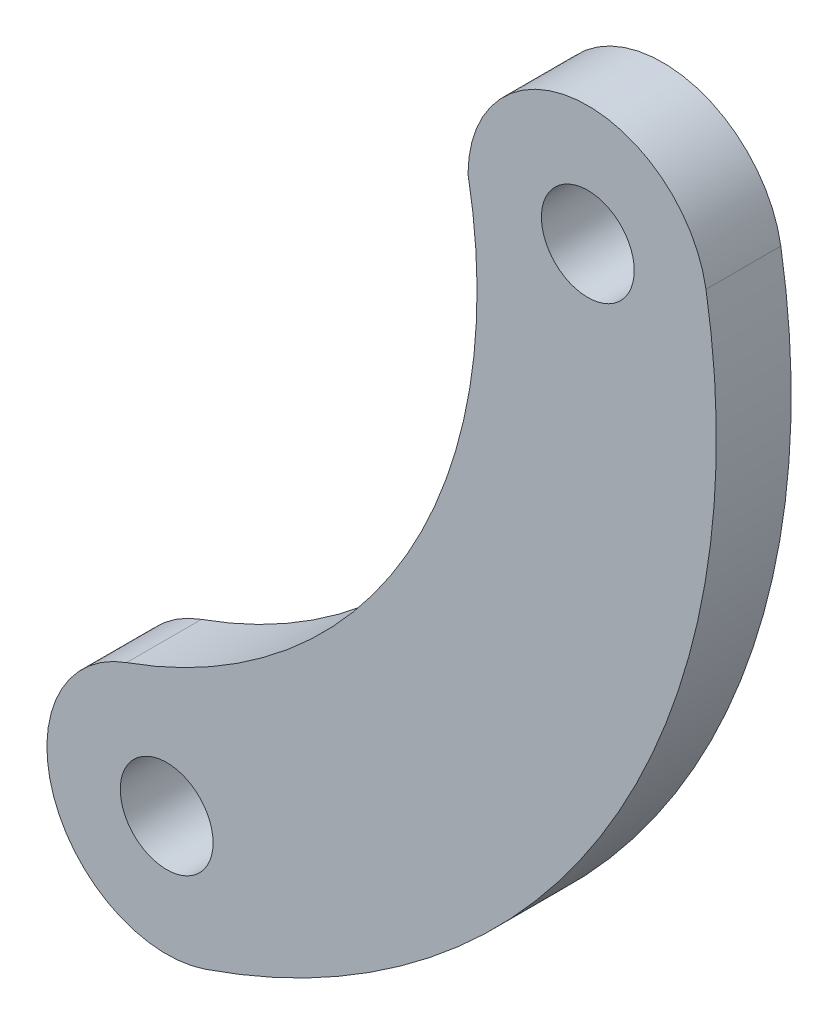
ISO-10303-21;
HEADER;
FILE_DESCRIPTION(('STEP AP214'),'2;1');
FILE_NAME('part.step','',(''),(''),'','','');
FILE_SCHEMA(('AUTOMOTIVE_DESIGN { 1 0 10303 214 1 1 1 1 }'));
ENDSEC;
DATA;
#1=APPLICATION_CONTEXT('core data for automotive mechanical design processes');
#2=APPLICATION_PROTOCOL_DEFINITION('international standard','automotive_design',2000,#1);
#3=PRODUCT_CONTEXT('',#1,'mechanical');
#4=PRODUCT('Part','Part','',(#3));
#5=PRODUCT_RELATED_PRODUCT_CATEGORY('part','',(#4));
#6=PRODUCT_DEFINITION_FORMATION('','',#4);
#7=PRODUCT_DEFINITION_CONTEXT('part definition',#1,'design');
#8=PRODUCT_DEFINITION('design','',#6,#7);
#9=PRODUCT_DEFINITION_SHAPE('','',#8);
#10=(LENGTH_UNIT() NAMED_UNIT(*) SI_UNIT(.MILLI.,.METRE.));
#11=(NAMED_UNIT(*) PLANE_ANGLE_UNIT() SI_UNIT($,.RADIAN.));
#12=(NAMED_UNIT(*) SI_UNIT($,.STERADIAN.) SOLID_ANGLE_UNIT());
#13=UNCERTAINTY_MEASURE_WITH_UNIT(LENGTH_MEASURE(1.E-05),#10,'distance_accuracy_value','');
#14=(GEOMETRIC_REPRESENTATION_CONTEXT(3) GLOBAL_UNCERTAINTY_ASSIGNED_CONTEXT((#13)) GLOBAL_UNIT_ASSIGNED_CONTEXT((#10,
#11,#12)) REPRESENTATION_CONTEXT('',''));
#15=CARTESIAN_POINT('',(0.,0.,0.));
#16=DIRECTION('',(0.,0.,1.));
#17=DIRECTION('',(1.,0.,0.));
#18=AXIS2_PLACEMENT_3D('',#15,#16,#17);
#19=CARTESIAN_POINT('',(-2.67304825428944,-6.90797107722297,2.5));
#20=DIRECTION('',(0.,0.,-1.));
#21=DIRECTION('',(-1.,0.,0.));
#22=AXIS2_PLACEMENT_3D('',#19,#20,#21);
#23=PLANE('',#22);
#24=CARTESIAN_POINT('',(7.79019795096132,-5.15608642723372,2.5));
#25=DIRECTION('',(0.,0.,1.));
#26=DIRECTION('',(-1.,0.,0.));
#27=AXIS2_PLACEMENT_3D('',#24,#25,#26);
#28=CIRCLE('',#27,4.00206583250989);
#29=CARTESIAN_POINT('',(11.7373202586664,-4.49521093535922,2.5));
#30=VERTEX_POINT('',#29);
#31=CARTESIAN_POINT('',(3.78820929800643,-5.13123186299868,2.5));
#32=VERTEX_POINT('',#31);
#33=EDGE_CURVE('E87',#30,#32,#28,.T.);
#34=ORIENTED_EDGE('',*,*,#33,.T.);
#35=CARTESIAN_POINT('',(-13.5144426672139,-8.38303497187139,2.5));
#36=DIRECTION('',(0.,0.,-1.));
#37=DIRECTION('',(-1.,0.,0.));
#38=AXIS2_PLACEMENT_3D('',#35,#36,#37);
#39=CIRCLE('',#38,17.6055669743527);
#40=CARTESIAN_POINT('',(-7.61656877226157,-24.9713161368281,2.5));
#41=VERTEX_POINT('',#40);
#42=EDGE_CURVE('E82',#32,#41,#39,.T.);
#43=ORIENTED_EDGE('',*,*,#42,.T.);
#44=CARTESIAN_POINT('',(-6.27654089453044,-28.7402606074299,2.5));
#45=DIRECTION('',(0.,0.,1.));
#46=DIRECTION('',(1.,0.,0.));
#47=AXIS2_PLACEMENT_3D('',#44,#45,#46);
#48=CIRCLE('',#47,4.0000771412032);
#49=CARTESIAN_POINT('',(-4.9834290413539,-32.5255583329399,2.5));
#50=VERTEX_POINT('',#49);
#51=EDGE_CURVE('E85',#41,#50,#48,.T.);
#52=ORIENTED_EDGE('',*,*,#51,.T.);
#53=CARTESIAN_POINT('',(-13.1362944595402,-8.65985572721223,2.5));
#54=DIRECTION('',(0.,0.,1.));
#55=DIRECTION('',(-1.,0.,0.));
#56=AXIS2_PLACEMENT_3D('',#53,#54,#55);
#57=CIRCLE('',#56,25.2198528027443);
#58=EDGE_CURVE('E52',#50,#30,#57,.T.);
#59=ORIENTED_EDGE('',*,*,#58,.T.);
#60=EDGE_LOOP('',(#34,#43,#52,#59));
#61=FACE_BOUND('',#60,.T.);
#62=CARTESIAN_POINT('',(7.79019795096132,-5.15608642723372,2.5));
#63=DIRECTION('',(0.,0.,1.));
#64=DIRECTION('',(1.,0.,0.));
#65=AXIS2_PLACEMENT_3D('',#62,#63,#64);
#66=CIRCLE('',#65,1.55);
#67=CARTESIAN_POINT('',(9.34019795096132,-5.15608642723372,2.5));
#68=VERTEX_POINT('',#67);
#69=EDGE_CURVE('E102',#68,#68,#66,.T.);
#70=ORIENTED_EDGE('',*,*,#69,.F.);
#71=EDGE_LOOP('',(#70));
#72=FACE_BOUND('',#71,.T.);
#73=CARTESIAN_POINT('',(-6.27654089453044,-28.7402606074299,2.5));
#74=DIRECTION('',(0.,0.,1.));
#75=DIRECTION('',(1.,0.,0.));
#76=AXIS2_PLACEMENT_3D('',#73,#74,#75);
#77=CIRCLE('',#76,1.55);
#78=CARTESIAN_POINT('',(-4.72654089453044,-28.7402606074299,2.5));
#79=VERTEX_POINT('',#78);
#80=EDGE_CURVE('E117',#79,#79,#77,.T.);
#81=ORIENTED_EDGE('',*,*,#80,.F.);
#82=EDGE_LOOP('',(#81));
#83=FACE_BOUND('',#82,.T.);
#84=ADVANCED_FACE('F35',(#61,#72,#83),#23,.F.);
#85=CARTESIAN_POINT('',(-2.67304825428944,-6.90797107722297,0.));
#86=DIRECTION('',(0.,0.,-1.));
#87=DIRECTION('',(-1.,0.,0.));
#88=AXIS2_PLACEMENT_3D('',#85,#86,#87);
#89=PLANE('',#88);
#90=CARTESIAN_POINT('',(7.79019795096132,-5.15608642723372,0.));
#91=DIRECTION('',(0.,0.,1.));
#92=DIRECTION('',(1.,0.,0.));
#93=AXIS2_PLACEMENT_3D('',#90,#91,#92);
#94=CIRCLE('',#93,1.55);
#95=CARTESIAN_POINT('',(9.34019795096132,-5.15608642723372,0.));
#96=VERTEX_POINT('',#95);
#97=EDGE_CURVE('E114',#96,#96,#94,.T.);
#98=ORIENTED_EDGE('',*,*,#97,.T.);
#99=EDGE_LOOP('',(#98));
#100=FACE_BOUND('',#99,.T.);
#101=CARTESIAN_POINT('',(7.79019795096132,-5.15608642723372,0.));
#102=DIRECTION('',(0.,0.,1.));
#103=DIRECTION('',(-1.,0.,0.));
#104=AXIS2_PLACEMENT_3D('',#101,#102,#103);
#105=CIRCLE('',#104,4.00206583250989);
#106=CARTESIAN_POINT('',(11.7373202586664,-4.49521093535922,0.));
#107=VERTEX_POINT('',#106);
#108=CARTESIAN_POINT('',(3.78820929800643,-5.13123186299868,0.));
#109=VERTEX_POINT('',#108);
#110=EDGE_CURVE('E99',#107,#109,#105,.T.);
#111=ORIENTED_EDGE('',*,*,#110,.F.);
#112=CARTESIAN_POINT('',(-13.1362944595402,-8.65985572721223,0.));
#113=DIRECTION('',(0.,0.,1.));
#114=DIRECTION('',(-1.,0.,0.));
#115=AXIS2_PLACEMENT_3D('',#112,#113,#114);
#116=CIRCLE('',#115,25.2198528027443);
#117=CARTESIAN_POINT('',(-4.9834290413539,-32.5255583329399,0.));
#118=VERTEX_POINT('',#117);
#119=EDGE_CURVE('E75',#118,#107,#116,.T.);
#120=ORIENTED_EDGE('',*,*,#119,.F.);
#121=CARTESIAN_POINT('',(-6.27654089453044,-28.7402606074299,0.));
#122=DIRECTION('',(0.,0.,1.));
#123=DIRECTION('',(1.,0.,0.));
#124=AXIS2_PLACEMENT_3D('',#121,#122,#123);
#125=CIRCLE('',#124,4.0000771412032);
#126=CARTESIAN_POINT('',(-7.61656877226157,-24.9713161368281,0.));
#127=VERTEX_POINT('',#126);
#128=EDGE_CURVE('E69',#127,#118,#125,.T.);
#129=ORIENTED_EDGE('',*,*,#128,.F.);
#130=CARTESIAN_POINT('',(-13.5144426672139,-8.38303497187139,0.));
#131=DIRECTION('',(0.,0.,-1.));
#132=DIRECTION('',(-1.,0.,0.));
#133=AXIS2_PLACEMENT_3D('',#130,#131,#132);
#134=CIRCLE('',#133,17.6055669743527);
#135=EDGE_CURVE('E91',#109,#127,#134,.T.);
#136=ORIENTED_EDGE('',*,*,#135,.F.);
#137=EDGE_LOOP('',(#111,#120,#129,#136));
#138=FACE_BOUND('',#137,.T.);
#139=CARTESIAN_POINT('',(-6.27654089453044,-28.7402606074299,0.));
#140=DIRECTION('',(0.,0.,1.));
#141=DIRECTION('',(1.,0.,0.));
#142=AXIS2_PLACEMENT_3D('',#139,#140,#141);
#143=CIRCLE('',#142,1.55);
#144=CARTESIAN_POINT('',(-4.72654089453044,-28.7402606074299,0.));
#145=VERTEX_POINT('',#144);
#146=EDGE_CURVE('E120',#145,#145,#143,.T.);
#147=ORIENTED_EDGE('',*,*,#146,.T.);
#148=EDGE_LOOP('',(#147));
#149=FACE_BOUND('',#148,.T.);
#150=ADVANCED_FACE('F110',(#100,#138,#149),#89,.T.);
#151=CARTESIAN_POINT('',(7.79019795096132,-5.15608642723372,2.5));
#152=DIRECTION('',(0.,0.,-1.));
#153=DIRECTION('',(-1.,0.,0.));
#154=AXIS2_PLACEMENT_3D('',#151,#152,#153);
#155=CYLINDRICAL_SURFACE('',#154,4.00206583250989);
#156=ORIENTED_EDGE('',*,*,#110,.T.);
#157=DIRECTION('',(0.,0.,-1.));
#158=VECTOR('',#157,1.);
#159=CARTESIAN_POINT('',(3.78820929800643,-5.13123186299868,2.5));
#160=LINE('',#159,#158);
#161=EDGE_CURVE('E11',#32,#109,#160,.T.);
#162=ORIENTED_EDGE('',*,*,#161,.F.);
#163=ORIENTED_EDGE('',*,*,#33,.F.);
#164=DIRECTION('',(0.,0.,-1.));
#165=VECTOR('',#164,1.);
#166=CARTESIAN_POINT('',(11.7373202586664,-4.49521093535922,2.5));
#167=LINE('',#166,#165);
#168=EDGE_CURVE('E95',#30,#107,#167,.T.);
#169=ORIENTED_EDGE('',*,*,#168,.T.);
#170=EDGE_LOOP('',(#156,#162,#163,#169));
#171=FACE_BOUND('',#170,.T.);
#172=ADVANCED_FACE('F37',(#171),#155,.T.);
#173=CARTESIAN_POINT('',(-13.5144426672139,-8.38303497187139,2.5));
#174=DIRECTION('',(0.,0.,-1.));
#175=DIRECTION('',(-1.,0.,0.));
#176=AXIS2_PLACEMENT_3D('',#173,#174,#175);
#177=CYLINDRICAL_SURFACE('',#176,17.6055669743527);
#178=ORIENTED_EDGE('',*,*,#135,.T.);
#179=DIRECTION('',(0.,0.,-1.));
#180=VECTOR('',#179,1.);
#181=CARTESIAN_POINT('',(-7.61656877226157,-24.9713161368281,2.5));
#182=LINE('',#181,#180);
#183=EDGE_CURVE('E44',#41,#127,#182,.T.);
#184=ORIENTED_EDGE('',*,*,#183,.F.);
#185=ORIENTED_EDGE('',*,*,#42,.F.);
#186=ORIENTED_EDGE('',*,*,#161,.T.);
#187=EDGE_LOOP('',(#178,#184,#185,#186));
#188=FACE_BOUND('',#187,.T.);
#189=ADVANCED_FACE('F90',(#188),#177,.F.);
#190=CARTESIAN_POINT('',(-6.27654089453044,-28.7402606074299,2.5));
#191=DIRECTION('',(0.,0.,-1.));
#192=DIRECTION('',(-1.,0.,0.));
#193=AXIS2_PLACEMENT_3D('',#190,#191,#192);
#194=CYLINDRICAL_SURFACE('',#193,4.0000771412032);
#195=ORIENTED_EDGE('',*,*,#128,.T.);
#196=DIRECTION('',(0.,0.,-1.));
#197=VECTOR('',#196,1.);
#198=CARTESIAN_POINT('',(-4.9834290413539,-32.5255583329399,2.5));
#199=LINE('',#198,#197);
#200=EDGE_CURVE('E92',#50,#118,#199,.T.);
#201=ORIENTED_EDGE('',*,*,#200,.F.);
#202=ORIENTED_EDGE('',*,*,#51,.F.);
#203=ORIENTED_EDGE('',*,*,#183,.T.);
#204=EDGE_LOOP('',(#195,#201,#202,#203));
#205=FACE_BOUND('',#204,.T.);
#206=ADVANCED_FACE('F93',(#205),#194,.T.);
#207=CARTESIAN_POINT('',(-13.1362944595402,-8.65985572721223,2.5));
#208=DIRECTION('',(0.,0.,-1.));
#209=DIRECTION('',(-1.,0.,0.));
#210=AXIS2_PLACEMENT_3D('',#207,#208,#209);
#211=CYLINDRICAL_SURFACE('',#210,25.2198528027443);
#212=ORIENTED_EDGE('',*,*,#119,.T.);
#213=ORIENTED_EDGE('',*,*,#168,.F.);
#214=ORIENTED_EDGE('',*,*,#58,.F.);
#215=ORIENTED_EDGE('',*,*,#200,.T.);
#216=EDGE_LOOP('',(#212,#213,#214,#215));
#217=FACE_BOUND('',#216,.T.);
#218=ADVANCED_FACE('F107',(#217),#211,.T.);
#219=CARTESIAN_POINT('',(7.79019795096132,-5.15608642723372,2.5));
#220=DIRECTION('',(0.,0.,-1.));
#221=DIRECTION('',(-1.,0.,0.));
#222=AXIS2_PLACEMENT_3D('',#219,#220,#221);
#223=CYLINDRICAL_SURFACE('',#222,1.55);
#224=ORIENTED_EDGE('',*,*,#69,.T.);
#225=EDGE_LOOP('',(#224));
#226=FACE_BOUND('',#225,.T.);
#227=ORIENTED_EDGE('',*,*,#97,.F.);
#228=EDGE_LOOP('',(#227));
#229=FACE_BOUND('',#228,.T.);
#230=ADVANCED_FACE('F137',(#226,#229),#223,.F.);
#231=CARTESIAN_POINT('',(-6.27654089453044,-28.7402606074299,2.5));
#232=DIRECTION('',(0.,0.,-1.));
#233=DIRECTION('',(-1.,0.,0.));
#234=AXIS2_PLACEMENT_3D('',#231,#232,#233);
#235=CYLINDRICAL_SURFACE('',#234,1.55);
#236=ORIENTED_EDGE('',*,*,#80,.T.);
#237=EDGE_LOOP('',(#236));
#238=FACE_BOUND('',#237,.T.);
#239=ORIENTED_EDGE('',*,*,#146,.F.);
#240=EDGE_LOOP('',(#239));
#241=FACE_BOUND('',#240,.T.);
#242=ADVANCED_FACE('F126',(#238,#241),#235,.F.);
#243=CLOSED_SHELL('',(#84,#150,#172,#189,#206,#218,#230,#242));
#244=MANIFOLD_SOLID_BREP('B2',#243);
#245=ADVANCED_BREP_SHAPE_REPRESENTATION('',(#18,#244),#14);
#246=SHAPE_DEFINITION_REPRESENTATION(#9,#245);
ENDSEC;
END-ISO-10303-21;
